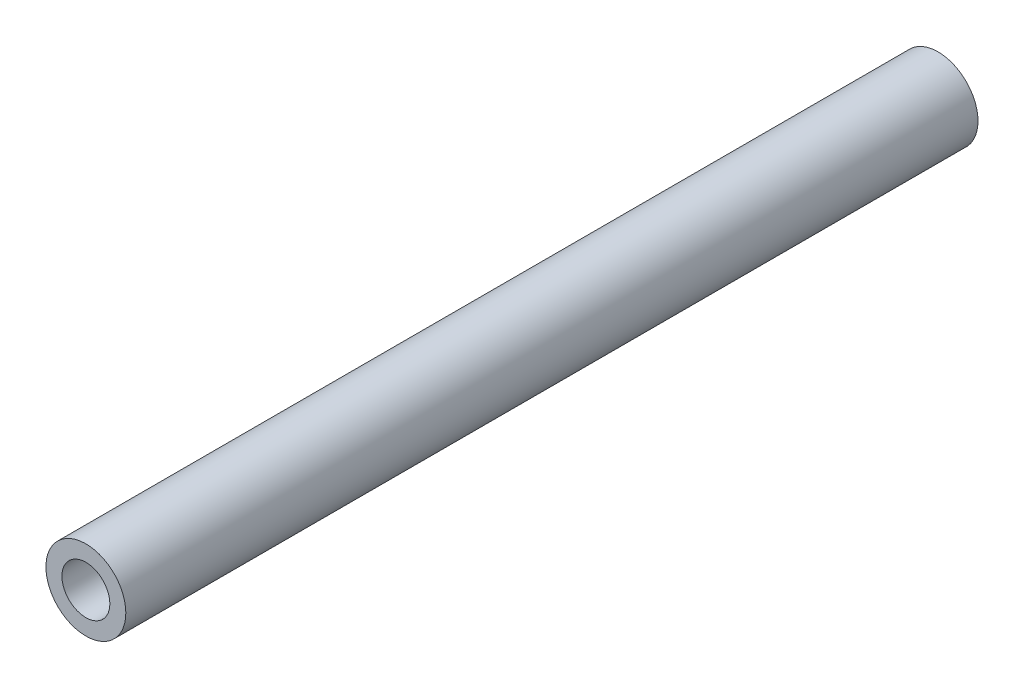
ISO-10303-21;
HEADER;
FILE_DESCRIPTION(('STEP AP214'),'2;1');
FILE_NAME('part.step','',(''),(''),'','','');
FILE_SCHEMA(('AUTOMOTIVE_DESIGN { 1 0 10303 214 1 1 1 1 }'));
ENDSEC;
DATA;
#1=APPLICATION_CONTEXT('core data for automotive mechanical design processes');
#2=APPLICATION_PROTOCOL_DEFINITION('international standard','automotive_design',2000,#1);
#3=PRODUCT_CONTEXT('',#1,'mechanical');
#4=PRODUCT('Part','Part','',(#3));
#5=PRODUCT_RELATED_PRODUCT_CATEGORY('part','',(#4));
#6=PRODUCT_DEFINITION_FORMATION('','',#4);
#7=PRODUCT_DEFINITION_CONTEXT('part definition',#1,'design');
#8=PRODUCT_DEFINITION('design','',#6,#7);
#9=PRODUCT_DEFINITION_SHAPE('','',#8);
#10=(LENGTH_UNIT() NAMED_UNIT(*) SI_UNIT(.MILLI.,.METRE.));
#11=(NAMED_UNIT(*) PLANE_ANGLE_UNIT() SI_UNIT($,.RADIAN.));
#12=(NAMED_UNIT(*) SI_UNIT($,.STERADIAN.) SOLID_ANGLE_UNIT());
#13=UNCERTAINTY_MEASURE_WITH_UNIT(LENGTH_MEASURE(1.E-05),#10,'distance_accuracy_value','');
#14=(GEOMETRIC_REPRESENTATION_CONTEXT(3) GLOBAL_UNCERTAINTY_ASSIGNED_CONTEXT((#13)) GLOBAL_UNIT_ASSIGNED_CONTEXT((#10,
#11,#12)) REPRESENTATION_CONTEXT('',''));
#15=CARTESIAN_POINT('',(0.,0.,0.));
#16=DIRECTION('',(0.,0.,1.));
#17=DIRECTION('',(1.,0.,0.));
#18=AXIS2_PLACEMENT_3D('',#15,#16,#17);
#19=CARTESIAN_POINT('',(0.,0.,32.));
#20=DIRECTION('',(0.,0.,1.));
#21=DIRECTION('',(1.,0.,0.));
#22=AXIS2_PLACEMENT_3D('',#19,#20,#21);
#23=PLANE('',#22);
#24=CARTESIAN_POINT('',(0.,0.,32.));
#25=DIRECTION('',(0.,0.,1.));
#26=DIRECTION('',(1.,0.,0.));
#27=AXIS2_PLACEMENT_3D('',#24,#25,#26);
#28=CIRCLE('',#27,1.5);
#29=CARTESIAN_POINT('',(1.5,0.,32.));
#30=VERTEX_POINT('',#29);
#31=EDGE_CURVE('E10',#30,#30,#28,.T.);
#32=ORIENTED_EDGE('',*,*,#31,.T.);
#33=EDGE_LOOP('',(#32));
#34=FACE_BOUND('',#33,.T.);
#35=CARTESIAN_POINT('',(0.,0.,32.));
#36=DIRECTION('',(0.,0.,1.));
#37=DIRECTION('',(1.,0.,0.));
#38=AXIS2_PLACEMENT_3D('',#35,#36,#37);
#39=CIRCLE('',#38,0.9);
#40=CARTESIAN_POINT('',(0.9,0.,32.));
#41=VERTEX_POINT('',#40);
#42=EDGE_CURVE('E41',#41,#41,#39,.T.);
#43=ORIENTED_EDGE('',*,*,#42,.F.);
#44=EDGE_LOOP('',(#43));
#45=FACE_BOUND('',#44,.T.);
#46=ADVANCED_FACE('F30',(#34,#45),#23,.T.);
#47=CARTESIAN_POINT('',(0.,0.,0.));
#48=DIRECTION('',(0.,0.,1.));
#49=DIRECTION('',(1.,0.,0.));
#50=AXIS2_PLACEMENT_3D('',#47,#48,#49);
#51=PLANE('',#50);
#52=CARTESIAN_POINT('',(0.,0.,0.));
#53=DIRECTION('',(0.,0.,1.));
#54=DIRECTION('',(1.,0.,0.));
#55=AXIS2_PLACEMENT_3D('',#52,#53,#54);
#56=CIRCLE('',#55,1.5);
#57=CARTESIAN_POINT('',(1.5,0.,0.));
#58=VERTEX_POINT('',#57);
#59=EDGE_CURVE('E34',#58,#58,#56,.T.);
#60=ORIENTED_EDGE('',*,*,#59,.F.);
#61=EDGE_LOOP('',(#60));
#62=FACE_BOUND('',#61,.T.);
#63=CARTESIAN_POINT('',(0.,0.,0.));
#64=DIRECTION('',(0.,0.,1.));
#65=DIRECTION('',(1.,0.,0.));
#66=AXIS2_PLACEMENT_3D('',#63,#64,#65);
#67=CIRCLE('',#66,0.9);
#68=CARTESIAN_POINT('',(0.9,0.,0.));
#69=VERTEX_POINT('',#68);
#70=EDGE_CURVE('E43',#69,#69,#67,.T.);
#71=ORIENTED_EDGE('',*,*,#70,.T.);
#72=EDGE_LOOP('',(#71));
#73=FACE_BOUND('',#72,.T.);
#74=ADVANCED_FACE('F53',(#62,#73),#51,.F.);
#75=CARTESIAN_POINT('',(0.,0.,32.));
#76=DIRECTION('',(0.,0.,-1.));
#77=DIRECTION('',(-1.,0.,0.));
#78=AXIS2_PLACEMENT_3D('',#75,#76,#77);
#79=CYLINDRICAL_SURFACE('',#78,1.5);
#80=ORIENTED_EDGE('',*,*,#31,.F.);
#81=EDGE_LOOP('',(#80));
#82=FACE_BOUND('',#81,.T.);
#83=ORIENTED_EDGE('',*,*,#59,.T.);
#84=EDGE_LOOP('',(#83));
#85=FACE_BOUND('',#84,.T.);
#86=ADVANCED_FACE('F32',(#82,#85),#79,.T.);
#87=CARTESIAN_POINT('',(0.,0.,32.));
#88=DIRECTION('',(0.,0.,-1.));
#89=DIRECTION('',(-1.,0.,0.));
#90=AXIS2_PLACEMENT_3D('',#87,#88,#89);
#91=CYLINDRICAL_SURFACE('',#90,0.9);
#92=ORIENTED_EDGE('',*,*,#42,.T.);
#93=EDGE_LOOP('',(#92));
#94=FACE_BOUND('',#93,.T.);
#95=ORIENTED_EDGE('',*,*,#70,.F.);
#96=EDGE_LOOP('',(#95));
#97=FACE_BOUND('',#96,.T.);
#98=ADVANCED_FACE('F49',(#94,#97),#91,.F.);
#99=CLOSED_SHELL('',(#46,#74,#86,#98));
#100=MANIFOLD_SOLID_BREP('B2',#99);
#101=ADVANCED_BREP_SHAPE_REPRESENTATION('',(#18,#100),#14);
#102=SHAPE_DEFINITION_REPRESENTATION(#9,#101);
ENDSEC;
END-ISO-10303-21;
